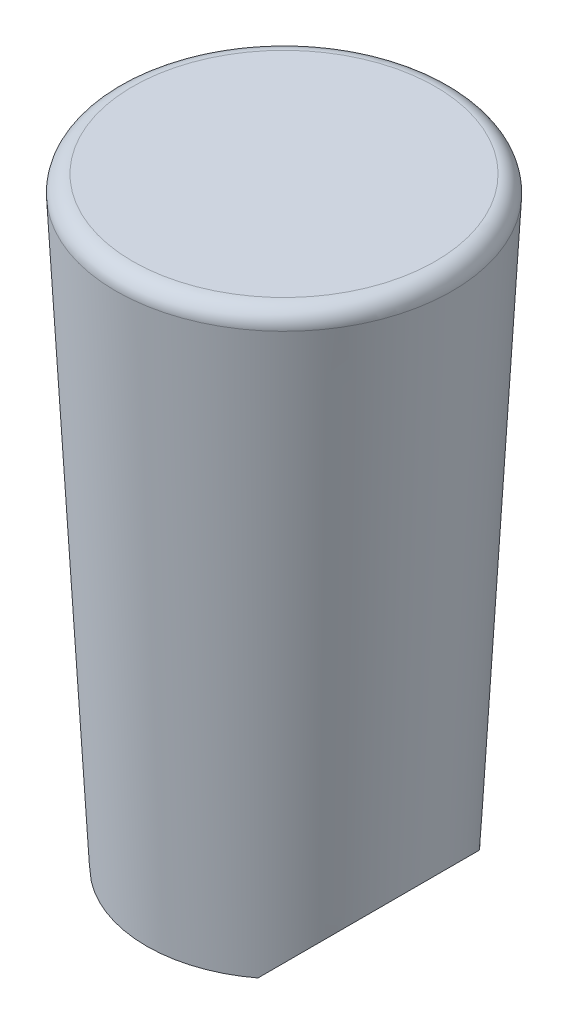
ISO-10303-21;
HEADER;
FILE_DESCRIPTION(('STEP AP214'),'2;1');
FILE_NAME('part.step','',(''),(''),'','','');
FILE_SCHEMA(('AUTOMOTIVE_DESIGN { 1 0 10303 214 1 1 1 1 }'));
ENDSEC;
DATA;
#1=APPLICATION_CONTEXT('core data for automotive mechanical design processes');
#2=APPLICATION_PROTOCOL_DEFINITION('international standard','automotive_design',2000,#1);
#3=PRODUCT_CONTEXT('',#1,'mechanical');
#4=PRODUCT('Part','Part','',(#3));
#5=PRODUCT_RELATED_PRODUCT_CATEGORY('part','',(#4));
#6=PRODUCT_DEFINITION_FORMATION('','',#4);
#7=PRODUCT_DEFINITION_CONTEXT('part definition',#1,'design');
#8=PRODUCT_DEFINITION('design','',#6,#7);
#9=PRODUCT_DEFINITION_SHAPE('','',#8);
#10=(LENGTH_UNIT() NAMED_UNIT(*) SI_UNIT(.MILLI.,.METRE.));
#11=(NAMED_UNIT(*) PLANE_ANGLE_UNIT() SI_UNIT($,.RADIAN.));
#12=(NAMED_UNIT(*) SI_UNIT($,.STERADIAN.) SOLID_ANGLE_UNIT());
#13=UNCERTAINTY_MEASURE_WITH_UNIT(LENGTH_MEASURE(1.E-05),#10,'distance_accuracy_value','');
#14=(GEOMETRIC_REPRESENTATION_CONTEXT(3) GLOBAL_UNCERTAINTY_ASSIGNED_CONTEXT((#13)) GLOBAL_UNIT_ASSIGNED_CONTEXT((#10,
#11,#12)) REPRESENTATION_CONTEXT('',''));
#15=CARTESIAN_POINT('',(0.,0.,0.));
#16=DIRECTION('',(0.,0.,1.));
#17=DIRECTION('',(1.,0.,0.));
#18=AXIS2_PLACEMENT_3D('',#15,#16,#17);
#19=CARTESIAN_POINT('',(0.,0.,0.));
#20=DIRECTION('',(0.,1.,0.));
#21=DIRECTION('',(0.,0.,1.));
#22=AXIS2_PLACEMENT_3D('',#19,#20,#21);
#23=CONICAL_SURFACE('',#22,8.25,0.05235987755983);
#24=CARTESIAN_POINT('',(0.,34.9476640437571,0.));
#25=DIRECTION('',(0.,1.,0.));
#26=DIRECTION('',(0.,0.,1.));
#27=AXIS2_PLACEMENT_3D('',#24,#25,#26);
#28=CIRCLE('',#27,10.0815294636631);
#29=CARTESIAN_POINT('',(0.,34.9476640437571,10.0815294636631));
#30=VERTEX_POINT('',#29);
#31=EDGE_CURVE('E11',#30,#30,#28,.F.);
#32=ORIENTED_EDGE('',*,*,#31,.T.);
#33=EDGE_LOOP('',(#32));
#34=FACE_BOUND('',#33,.T.);
#35=CARTESIAN_POINT('',(0.,0.,0.));
#36=DIRECTION('',(0.,1.,0.));
#37=DIRECTION('',(0.,0.,1.));
#38=AXIS2_PLACEMENT_3D('',#35,#36,#37);
#39=CIRCLE('',#38,8.25);
#40=CARTESIAN_POINT('',(5.,0.,-6.56220237420334));
#41=VERTEX_POINT('',#40);
#42=CARTESIAN_POINT('',(-5.,0.,-6.56220237420334));
#43=VERTEX_POINT('',#42);
#44=EDGE_CURVE('E92',#41,#43,#39,.T.);
#45=ORIENTED_EDGE('',*,*,#44,.T.);
#46=CARTESIAN_POINT('',(-0.419784271562127,-4.58021572843789,0.));
#47=DIRECTION('',(0.707106781186549,0.707106781186546,0.));
#48=DIRECTION('',(-0.707106781186546,0.707106781186549,0.));
#49=AXIS2_PLACEMENT_3D('',#46,#47,#48);
#50=ELLIPSE('',#49,11.3277955722534,7.99895352085075);
#51=CARTESIAN_POINT('',(-5.,0.,6.56220237420334));
#52=VERTEX_POINT('',#51);
#53=EDGE_CURVE('E46',#43,#52,#50,.T.);
#54=ORIENTED_EDGE('',*,*,#53,.T.);
#55=CARTESIAN_POINT('',(5.,0.,6.56220237420334));
#56=VERTEX_POINT('',#55);
#57=EDGE_CURVE('E93',#52,#56,#39,.T.);
#58=ORIENTED_EDGE('',*,*,#57,.T.);
#59=CARTESIAN_POINT('',(0.419784271562128,-4.58021572843789,0.));
#60=DIRECTION('',(-0.707106781186549,0.707106781186546,0.));
#61=DIRECTION('',(0.707106781186546,0.707106781186549,0.));
#62=AXIS2_PLACEMENT_3D('',#59,#60,#61);
#63=ELLIPSE('',#62,11.3277955722534,7.99895352085075);
#64=EDGE_CURVE('E53',#56,#41,#63,.T.);
#65=ORIENTED_EDGE('',*,*,#64,.T.);
#66=EDGE_LOOP('',(#45,#54,#58,#65));
#67=FACE_BOUND('',#66,.T.);
#68=ADVANCED_FACE('F32',(#34,#67),#23,.T.);
#69=CARTESIAN_POINT('',(0.,36.,0.));
#70=DIRECTION('',(0.,1.,0.));
#71=DIRECTION('',(0.,0.,1.));
#72=AXIS2_PLACEMENT_3D('',#69,#70,#71);
#73=PLANE('',#72);
#74=CARTESIAN_POINT('',(0.,36.,0.));
#75=DIRECTION('',(0.,1.,0.));
#76=DIRECTION('',(0.,0.,1.));
#77=AXIS2_PLACEMENT_3D('',#74,#75,#76);
#78=CIRCLE('',#77,9.08289992890852);
#79=CARTESIAN_POINT('',(0.,36.,9.08289992890852));
#80=VERTEX_POINT('',#79);
#81=EDGE_CURVE('E40',#80,#80,#78,.T.);
#82=ORIENTED_EDGE('',*,*,#81,.T.);
#83=EDGE_LOOP('',(#82));
#84=FACE_BOUND('',#83,.T.);
#85=ADVANCED_FACE('F146',(#84),#73,.T.);
#86=CARTESIAN_POINT('',(0.,0.,0.));
#87=DIRECTION('',(0.,1.,0.));
#88=DIRECTION('',(0.,0.,1.));
#89=AXIS2_PLACEMENT_3D('',#86,#87,#88);
#90=PLANE('',#89);
#91=DIRECTION('',(1.,0.,0.));
#92=VECTOR('',#91,1.);
#93=CARTESIAN_POINT('',(-3.,0.,-5.));
#94=LINE('',#93,#92);
#95=CARTESIAN_POINT('',(-3.,0.,-5.));
#96=VERTEX_POINT('',#95);
#97=CARTESIAN_POINT('',(3.,0.,-5.));
#98=VERTEX_POINT('',#97);
#99=EDGE_CURVE('E103',#96,#98,#94,.T.);
#100=ORIENTED_EDGE('',*,*,#99,.F.);
#101=DIRECTION('',(0.,0.,-1.));
#102=VECTOR('',#101,1.);
#103=CARTESIAN_POINT('',(-3.,0.,5.));
#104=LINE('',#103,#102);
#105=CARTESIAN_POINT('',(-3.,0.,5.));
#106=VERTEX_POINT('',#105);
#107=EDGE_CURVE('E128',#106,#96,#104,.T.);
#108=ORIENTED_EDGE('',*,*,#107,.F.);
#109=DIRECTION('',(1.,0.,0.));
#110=VECTOR('',#109,1.);
#111=CARTESIAN_POINT('',(-3.,0.,5.));
#112=LINE('',#111,#110);
#113=CARTESIAN_POINT('',(3.,0.,5.));
#114=VERTEX_POINT('',#113);
#115=EDGE_CURVE('E100',#106,#114,#112,.T.);
#116=ORIENTED_EDGE('',*,*,#115,.T.);
#117=DIRECTION('',(0.,0.,-1.));
#118=VECTOR('',#117,1.);
#119=CARTESIAN_POINT('',(3.,0.,5.));
#120=LINE('',#119,#118);
#121=EDGE_CURVE('E117',#114,#98,#120,.T.);
#122=ORIENTED_EDGE('',*,*,#121,.T.);
#123=EDGE_LOOP('',(#100,#108,#116,#122));
#124=FACE_BOUND('',#123,.T.);
#125=ORIENTED_EDGE('',*,*,#57,.F.);
#126=DIRECTION('',(0.,0.,1.));
#127=VECTOR('',#126,1.);
#128=CARTESIAN_POINT('',(-5.,0.,-23.));
#129=LINE('',#128,#127);
#130=EDGE_CURVE('E88',#43,#52,#129,.T.);
#131=ORIENTED_EDGE('',*,*,#130,.F.);
#132=ORIENTED_EDGE('',*,*,#44,.F.);
#133=DIRECTION('',(0.,0.,1.));
#134=VECTOR('',#133,1.);
#135=CARTESIAN_POINT('',(5.,0.,-23.));
#136=LINE('',#135,#134);
#137=EDGE_CURVE('E82',#41,#56,#136,.T.);
#138=ORIENTED_EDGE('',*,*,#137,.T.);
#139=EDGE_LOOP('',(#125,#131,#132,#138));
#140=FACE_BOUND('',#139,.T.);
#141=ADVANCED_FACE('F95',(#124,#140),#90,.F.);
#142=CARTESIAN_POINT('',(-3.,0.,5.));
#143=DIRECTION('',(0.,0.,1.));
#144=DIRECTION('',(1.,0.,0.));
#145=AXIS2_PLACEMENT_3D('',#142,#143,#144);
#146=PLANE('',#145);
#147=DIRECTION('',(0.,-1.,0.));
#148=VECTOR('',#147,1.);
#149=CARTESIAN_POINT('',(3.,0.,5.));
#150=LINE('',#149,#148);
#151=CARTESIAN_POINT('',(3.,25.,5.));
#152=VERTEX_POINT('',#151);
#153=EDGE_CURVE('E120',#152,#114,#150,.T.);
#154=ORIENTED_EDGE('',*,*,#153,.T.);
#155=ORIENTED_EDGE('',*,*,#115,.F.);
#156=DIRECTION('',(0.,-1.,0.));
#157=VECTOR('',#156,1.);
#158=CARTESIAN_POINT('',(-3.,0.,5.));
#159=LINE('',#158,#157);
#160=CARTESIAN_POINT('',(-3.,25.,5.));
#161=VERTEX_POINT('',#160);
#162=EDGE_CURVE('E113',#161,#106,#159,.T.);
#163=ORIENTED_EDGE('',*,*,#162,.F.);
#164=DIRECTION('',(1.,0.,0.));
#165=VECTOR('',#164,1.);
#166=CARTESIAN_POINT('',(-3.,25.,5.));
#167=LINE('',#166,#165);
#168=EDGE_CURVE('E98',#161,#152,#167,.T.);
#169=ORIENTED_EDGE('',*,*,#168,.T.);
#170=EDGE_LOOP('',(#154,#155,#163,#169));
#171=FACE_BOUND('',#170,.T.);
#172=ADVANCED_FACE('F155',(#171),#146,.F.);
#173=CARTESIAN_POINT('',(-3.,25.,0.));
#174=DIRECTION('',(1.,0.,0.));
#175=DIRECTION('',(0.,0.,-1.));
#176=AXIS2_PLACEMENT_3D('',#173,#174,#175);
#177=CYLINDRICAL_SURFACE('',#176,5.);
#178=CARTESIAN_POINT('',(3.,25.,0.));
#179=DIRECTION('',(1.,0.,0.));
#180=DIRECTION('',(0.,0.,1.));
#181=AXIS2_PLACEMENT_3D('',#178,#179,#180);
#182=CIRCLE('',#181,5.);
#183=CARTESIAN_POINT('',(3.,25.,-5.));
#184=VERTEX_POINT('',#183);
#185=EDGE_CURVE('E110',#184,#152,#182,.T.);
#186=ORIENTED_EDGE('',*,*,#185,.T.);
#187=ORIENTED_EDGE('',*,*,#168,.F.);
#188=CARTESIAN_POINT('',(-3.,25.,0.));
#189=DIRECTION('',(1.,0.,0.));
#190=DIRECTION('',(0.,0.,1.));
#191=AXIS2_PLACEMENT_3D('',#188,#189,#190);
#192=CIRCLE('',#191,5.);
#193=CARTESIAN_POINT('',(-3.,25.,-5.));
#194=VERTEX_POINT('',#193);
#195=EDGE_CURVE('E104',#194,#161,#192,.T.);
#196=ORIENTED_EDGE('',*,*,#195,.F.);
#197=DIRECTION('',(1.,0.,0.));
#198=VECTOR('',#197,1.);
#199=CARTESIAN_POINT('',(-3.,25.,-5.));
#200=LINE('',#199,#198);
#201=EDGE_CURVE('E107',#194,#184,#200,.T.);
#202=ORIENTED_EDGE('',*,*,#201,.T.);
#203=EDGE_LOOP('',(#186,#187,#196,#202));
#204=FACE_BOUND('',#203,.T.);
#205=ADVANCED_FACE('F160',(#204),#177,.F.);
#206=CARTESIAN_POINT('',(-3.,0.,-5.));
#207=DIRECTION('',(0.,0.,-1.));
#208=DIRECTION('',(0.,1.,0.));
#209=AXIS2_PLACEMENT_3D('',#206,#207,#208);
#210=PLANE('',#209);
#211=DIRECTION('',(0.,1.,0.));
#212=VECTOR('',#211,1.);
#213=CARTESIAN_POINT('',(3.,0.,-5.));
#214=LINE('',#213,#212);
#215=EDGE_CURVE('E114',#98,#184,#214,.T.);
#216=ORIENTED_EDGE('',*,*,#215,.T.);
#217=ORIENTED_EDGE('',*,*,#201,.F.);
#218=DIRECTION('',(0.,1.,0.));
#219=VECTOR('',#218,1.);
#220=CARTESIAN_POINT('',(-3.,0.,-5.));
#221=LINE('',#220,#219);
#222=EDGE_CURVE('E125',#96,#194,#221,.T.);
#223=ORIENTED_EDGE('',*,*,#222,.F.);
#224=ORIENTED_EDGE('',*,*,#99,.T.);
#225=EDGE_LOOP('',(#216,#217,#223,#224));
#226=FACE_BOUND('',#225,.T.);
#227=ADVANCED_FACE('F162',(#226),#210,.F.);
#228=CARTESIAN_POINT('',(-3.,25.,0.));
#229=DIRECTION('',(-1.,0.,0.));
#230=DIRECTION('',(0.,0.,1.));
#231=AXIS2_PLACEMENT_3D('',#228,#229,#230);
#232=PLANE('',#231);
#233=ORIENTED_EDGE('',*,*,#162,.T.);
#234=ORIENTED_EDGE('',*,*,#107,.T.);
#235=ORIENTED_EDGE('',*,*,#222,.T.);
#236=ORIENTED_EDGE('',*,*,#195,.T.);
#237=EDGE_LOOP('',(#233,#234,#235,#236));
#238=FACE_BOUND('',#237,.T.);
#239=ADVANCED_FACE('F165',(#238),#232,.F.);
#240=CARTESIAN_POINT('',(3.,25.,0.));
#241=DIRECTION('',(-1.,0.,0.));
#242=DIRECTION('',(0.,0.,1.));
#243=AXIS2_PLACEMENT_3D('',#240,#241,#242);
#244=PLANE('',#243);
#245=ORIENTED_EDGE('',*,*,#153,.F.);
#246=ORIENTED_EDGE('',*,*,#185,.F.);
#247=ORIENTED_EDGE('',*,*,#215,.F.);
#248=ORIENTED_EDGE('',*,*,#121,.F.);
#249=EDGE_LOOP('',(#245,#246,#247,#248));
#250=FACE_BOUND('',#249,.T.);
#251=ADVANCED_FACE('F142',(#250),#244,.T.);
#252=CARTESIAN_POINT('',(5.,0.,-23.));
#253=DIRECTION('',(-0.707106781186549,0.707106781186546,0.));
#254=DIRECTION('',(-0.707106781186546,-0.707106781186549,0.));
#255=AXIS2_PLACEMENT_3D('',#252,#253,#254);
#256=PLANE('',#255);
#257=ORIENTED_EDGE('',*,*,#137,.F.);
#258=ORIENTED_EDGE('',*,*,#64,.F.);
#259=EDGE_LOOP('',(#257,#258));
#260=FACE_BOUND('',#259,.T.);
#261=ADVANCED_FACE('F83',(#260),#256,.F.);
#262=CARTESIAN_POINT('',(-13.8330767034413,8.83307670344132,-23.));
#263=DIRECTION('',(0.707106781186549,0.707106781186546,0.));
#264=DIRECTION('',(-0.707106781186546,0.707106781186549,0.));
#265=AXIS2_PLACEMENT_3D('',#262,#263,#264);
#266=PLANE('',#265);
#267=ORIENTED_EDGE('',*,*,#130,.T.);
#268=ORIENTED_EDGE('',*,*,#53,.F.);
#269=EDGE_LOOP('',(#267,#268));
#270=FACE_BOUND('',#269,.T.);
#271=ADVANCED_FACE('F134',(#270),#266,.F.);
#272=CARTESIAN_POINT('',(0.,35.,0.));
#273=DIRECTION('',(0.,1.,0.));
#274=DIRECTION('',(0.,0.,1.));
#275=AXIS2_PLACEMENT_3D('',#272,#273,#274);
#276=TOROIDAL_SURFACE('',#275,9.08289992890852,1.);
#277=ORIENTED_EDGE('',*,*,#31,.F.);
#278=EDGE_LOOP('',(#277));
#279=FACE_BOUND('',#278,.T.);
#280=ORIENTED_EDGE('',*,*,#81,.F.);
#281=EDGE_LOOP('',(#280));
#282=FACE_BOUND('',#281,.T.);
#283=ADVANCED_FACE('F34',(#279,#282),#276,.T.);
#284=CLOSED_SHELL('',(#68,#85,#141,#172,#205,#227,#239,#251,#261,#271,#283));
#285=MANIFOLD_SOLID_BREP('B2',#284);
#286=ADVANCED_BREP_SHAPE_REPRESENTATION('',(#18,#285),#14);
#287=SHAPE_DEFINITION_REPRESENTATION(#9,#286);
ENDSEC;
END-ISO-10303-21;
